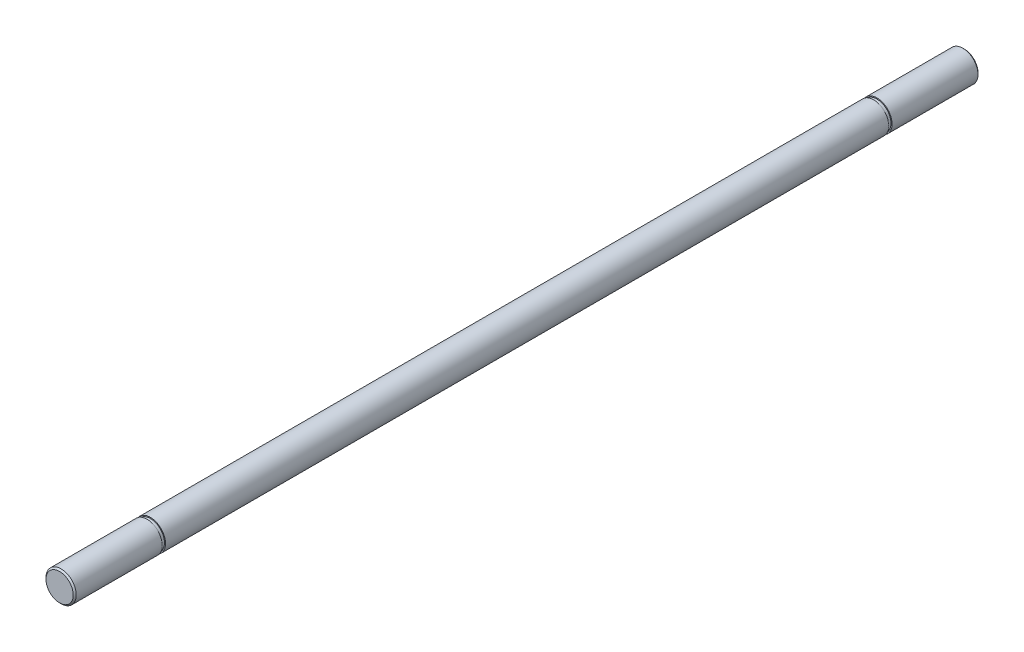
ISO-10303-21;
HEADER;
FILE_DESCRIPTION(('STEP AP214'),'2;1');
FILE_NAME('part.step','',(''),(''),'','','');
FILE_SCHEMA(('AUTOMOTIVE_DESIGN { 1 0 10303 214 1 1 1 1 }'));
ENDSEC;
DATA;
#1=APPLICATION_CONTEXT('core data for automotive mechanical design processes');
#2=APPLICATION_PROTOCOL_DEFINITION('international standard','automotive_design',2000,#1);
#3=PRODUCT_CONTEXT('',#1,'mechanical');
#4=PRODUCT('Part','Part','',(#3));
#5=PRODUCT_RELATED_PRODUCT_CATEGORY('part','',(#4));
#6=PRODUCT_DEFINITION_FORMATION('','',#4);
#7=PRODUCT_DEFINITION_CONTEXT('part definition',#1,'design');
#8=PRODUCT_DEFINITION('design','',#6,#7);
#9=PRODUCT_DEFINITION_SHAPE('','',#8);
#10=(LENGTH_UNIT() NAMED_UNIT(*) SI_UNIT(.MILLI.,.METRE.));
#11=(NAMED_UNIT(*) PLANE_ANGLE_UNIT() SI_UNIT($,.RADIAN.));
#12=(NAMED_UNIT(*) SI_UNIT($,.STERADIAN.) SOLID_ANGLE_UNIT());
#13=UNCERTAINTY_MEASURE_WITH_UNIT(LENGTH_MEASURE(1.E-05),#10,'distance_accuracy_value','');
#14=(GEOMETRIC_REPRESENTATION_CONTEXT(3) GLOBAL_UNCERTAINTY_ASSIGNED_CONTEXT((#13)) GLOBAL_UNIT_ASSIGNED_CONTEXT((#10,
#11,#12)) REPRESENTATION_CONTEXT('',''));
#15=CARTESIAN_POINT('',(0.,0.,0.));
#16=DIRECTION('',(0.,0.,1.));
#17=DIRECTION('',(1.,0.,0.));
#18=AXIS2_PLACEMENT_3D('',#15,#16,#17);
#19=CARTESIAN_POINT('',(0.,0.,149.5));
#20=DIRECTION('',(0.,0.,-1.));
#21=DIRECTION('',(-1.,0.,0.));
#22=AXIS2_PLACEMENT_3D('',#19,#20,#21);
#23=CYLINDRICAL_SURFACE('',#22,5.);
#24=CARTESIAN_POINT('',(0.,0.,119.5));
#25=DIRECTION('',(0.,0.,-1.));
#26=DIRECTION('',(-1.,0.,0.));
#27=AXIS2_PLACEMENT_3D('',#24,#25,#26);
#28=CIRCLE('',#27,5.);
#29=CARTESIAN_POINT('',(-5.,0.,119.5));
#30=VERTEX_POINT('',#29);
#31=EDGE_CURVE('E57',#30,#30,#28,.T.);
#32=ORIENTED_EDGE('',*,*,#31,.T.);
#33=EDGE_LOOP('',(#32));
#34=FACE_BOUND('',#33,.T.);
#35=CARTESIAN_POINT('',(0.,0.,-119.5));
#36=DIRECTION('',(0.,0.,1.));
#37=DIRECTION('',(1.,0.,0.));
#38=AXIS2_PLACEMENT_3D('',#35,#36,#37);
#39=CIRCLE('',#38,5.);
#40=CARTESIAN_POINT('',(5.,0.,-119.5));
#41=VERTEX_POINT('',#40);
#42=EDGE_CURVE('E52',#41,#41,#39,.T.);
#43=ORIENTED_EDGE('',*,*,#42,.T.);
#44=EDGE_LOOP('',(#43));
#45=FACE_BOUND('',#44,.T.);
#46=ADVANCED_FACE('F32',(#34,#45),#23,.T.);
#47=CARTESIAN_POINT('',(4.65,0.,-119.5));
#48=DIRECTION('',(0.,0.,1.));
#49=DIRECTION('',(1.,0.,0.));
#50=AXIS2_PLACEMENT_3D('',#47,#48,#49);
#51=PLANE('',#50);
#52=CARTESIAN_POINT('',(0.,0.,-119.5));
#53=DIRECTION('',(0.,0.,1.));
#54=DIRECTION('',(1.,0.,0.));
#55=AXIS2_PLACEMENT_3D('',#52,#53,#54);
#56=CIRCLE('',#55,4.65);
#57=CARTESIAN_POINT('',(4.65,0.,-119.5));
#58=VERTEX_POINT('',#57);
#59=EDGE_CURVE('E66',#58,#58,#56,.T.);
#60=ORIENTED_EDGE('',*,*,#59,.T.);
#61=EDGE_LOOP('',(#60));
#62=FACE_BOUND('',#61,.T.);
#63=ORIENTED_EDGE('',*,*,#42,.F.);
#64=EDGE_LOOP('',(#63));
#65=FACE_BOUND('',#64,.T.);
#66=ADVANCED_FACE('F88',(#62,#65),#51,.F.);
#67=CARTESIAN_POINT('',(4.65,0.,-120.6));
#68=DIRECTION('',(0.,0.,-1.));
#69=DIRECTION('',(-1.,0.,0.));
#70=AXIS2_PLACEMENT_3D('',#67,#68,#69);
#71=PLANE('',#70);
#72=CARTESIAN_POINT('',(0.,0.,-120.6));
#73=DIRECTION('',(0.,0.,1.));
#74=DIRECTION('',(1.,0.,0.));
#75=AXIS2_PLACEMENT_3D('',#72,#73,#74);
#76=CIRCLE('',#75,4.65);
#77=CARTESIAN_POINT('',(4.65,0.,-120.6));
#78=VERTEX_POINT('',#77);
#79=EDGE_CURVE('E56',#78,#78,#76,.T.);
#80=ORIENTED_EDGE('',*,*,#79,.F.);
#81=EDGE_LOOP('',(#80));
#82=FACE_BOUND('',#81,.T.);
#83=CARTESIAN_POINT('',(0.,0.,-120.6));
#84=DIRECTION('',(0.,0.,-1.));
#85=DIRECTION('',(-1.,0.,0.));
#86=AXIS2_PLACEMENT_3D('',#83,#84,#85);
#87=CIRCLE('',#86,5.);
#88=CARTESIAN_POINT('',(-5.,0.,-120.6));
#89=VERTEX_POINT('',#88);
#90=EDGE_CURVE('E63',#89,#89,#87,.T.);
#91=ORIENTED_EDGE('',*,*,#90,.F.);
#92=EDGE_LOOP('',(#91));
#93=FACE_BOUND('',#92,.T.);
#94=ADVANCED_FACE('F95',(#82,#93),#71,.F.);
#95=CARTESIAN_POINT('',(0.,0.,149.5));
#96=DIRECTION('',(0.,0.,1.));
#97=DIRECTION('',(1.,0.,0.));
#98=AXIS2_PLACEMENT_3D('',#95,#96,#97);
#99=CYLINDRICAL_SURFACE('',#98,4.65);
#100=ORIENTED_EDGE('',*,*,#59,.F.);
#101=EDGE_LOOP('',(#100));
#102=FACE_BOUND('',#101,.T.);
#103=ORIENTED_EDGE('',*,*,#79,.T.);
#104=EDGE_LOOP('',(#103));
#105=FACE_BOUND('',#104,.T.);
#106=ADVANCED_FACE('F101',(#102,#105),#99,.T.);
#107=CARTESIAN_POINT('',(0.,0.,-149.5));
#108=DIRECTION('',(0.,0.,1.));
#109=DIRECTION('',(1.,0.,0.));
#110=AXIS2_PLACEMENT_3D('',#107,#108,#109);
#111=PLANE('',#110);
#112=CARTESIAN_POINT('',(0.,0.,-149.5));
#113=DIRECTION('',(0.,0.,1.));
#114=DIRECTION('',(1.,0.,0.));
#115=AXIS2_PLACEMENT_3D('',#112,#113,#114);
#116=CIRCLE('',#115,4.50000000000003);
#117=CARTESIAN_POINT('',(4.50000000000003,0.,-149.5));
#118=VERTEX_POINT('',#117);
#119=EDGE_CURVE('E10',#118,#118,#116,.F.);
#120=ORIENTED_EDGE('',*,*,#119,.T.);
#121=EDGE_LOOP('',(#120));
#122=FACE_BOUND('',#121,.T.);
#123=ADVANCED_FACE('F108',(#122),#111,.F.);
#124=CARTESIAN_POINT('',(0.,0.,-149.));
#125=DIRECTION('',(0.,0.,1.));
#126=DIRECTION('',(1.,0.,0.));
#127=AXIS2_PLACEMENT_3D('',#124,#125,#126);
#128=CIRCLE('',#127,5.);
#129=CARTESIAN_POINT('',(5.,0.,-149.));
#130=VERTEX_POINT('',#129);
#131=EDGE_CURVE('E39',#130,#130,#128,.T.);
#132=ORIENTED_EDGE('',*,*,#131,.T.);
#133=EDGE_LOOP('',(#132));
#134=FACE_BOUND('',#133,.T.);
#135=ORIENTED_EDGE('',*,*,#90,.T.);
#136=EDGE_LOOP('',(#135));
#137=FACE_BOUND('',#136,.T.);
#138=ADVANCED_FACE('F90',(#134,#137),#23,.T.);
#139=CARTESIAN_POINT('',(4.65,0.,120.6));
#140=DIRECTION('',(0.,0.,1.));
#141=DIRECTION('',(1.,0.,0.));
#142=AXIS2_PLACEMENT_3D('',#139,#140,#141);
#143=PLANE('',#142);
#144=CARTESIAN_POINT('',(0.,0.,120.6));
#145=DIRECTION('',(0.,0.,1.));
#146=DIRECTION('',(1.,0.,0.));
#147=AXIS2_PLACEMENT_3D('',#144,#145,#146);
#148=CIRCLE('',#147,4.65);
#149=CARTESIAN_POINT('',(4.65,0.,120.6));
#150=VERTEX_POINT('',#149);
#151=EDGE_CURVE('E60',#150,#150,#148,.T.);
#152=ORIENTED_EDGE('',*,*,#151,.T.);
#153=EDGE_LOOP('',(#152));
#154=FACE_BOUND('',#153,.T.);
#155=CARTESIAN_POINT('',(0.,0.,120.6));
#156=DIRECTION('',(0.,0.,1.));
#157=DIRECTION('',(1.,0.,0.));
#158=AXIS2_PLACEMENT_3D('',#155,#156,#157);
#159=CIRCLE('',#158,5.);
#160=CARTESIAN_POINT('',(5.,0.,120.6));
#161=VERTEX_POINT('',#160);
#162=EDGE_CURVE('E53',#161,#161,#159,.T.);
#163=ORIENTED_EDGE('',*,*,#162,.F.);
#164=EDGE_LOOP('',(#163));
#165=FACE_BOUND('',#164,.T.);
#166=ADVANCED_FACE('F82',(#154,#165),#143,.F.);
#167=CARTESIAN_POINT('',(4.65,0.,119.5));
#168=DIRECTION('',(0.,0.,-1.));
#169=DIRECTION('',(-1.,0.,0.));
#170=AXIS2_PLACEMENT_3D('',#167,#168,#169);
#171=PLANE('',#170);
#172=CARTESIAN_POINT('',(0.,0.,119.5));
#173=DIRECTION('',(0.,0.,1.));
#174=DIRECTION('',(1.,0.,0.));
#175=AXIS2_PLACEMENT_3D('',#172,#173,#174);
#176=CIRCLE('',#175,4.65);
#177=CARTESIAN_POINT('',(4.65,0.,119.5));
#178=VERTEX_POINT('',#177);
#179=EDGE_CURVE('E73',#178,#178,#176,.T.);
#180=ORIENTED_EDGE('',*,*,#179,.F.);
#181=EDGE_LOOP('',(#180));
#182=FACE_BOUND('',#181,.T.);
#183=ORIENTED_EDGE('',*,*,#31,.F.);
#184=EDGE_LOOP('',(#183));
#185=FACE_BOUND('',#184,.T.);
#186=ADVANCED_FACE('F79',(#182,#185),#171,.F.);
#187=CARTESIAN_POINT('',(0.,0.,149.5));
#188=DIRECTION('',(0.,0.,1.));
#189=DIRECTION('',(1.,0.,0.));
#190=AXIS2_PLACEMENT_3D('',#187,#188,#189);
#191=CYLINDRICAL_SURFACE('',#190,4.65);
#192=ORIENTED_EDGE('',*,*,#151,.F.);
#193=EDGE_LOOP('',(#192));
#194=FACE_BOUND('',#193,.T.);
#195=ORIENTED_EDGE('',*,*,#179,.T.);
#196=EDGE_LOOP('',(#195));
#197=FACE_BOUND('',#196,.T.);
#198=ADVANCED_FACE('F77',(#194,#197),#191,.T.);
#199=CARTESIAN_POINT('',(0.,0.,149.5));
#200=DIRECTION('',(0.,0.,1.));
#201=DIRECTION('',(1.,0.,0.));
#202=AXIS2_PLACEMENT_3D('',#199,#200,#201);
#203=PLANE('',#202);
#204=CARTESIAN_POINT('',(0.,0.,149.5));
#205=DIRECTION('',(0.,0.,1.));
#206=DIRECTION('',(1.,0.,0.));
#207=AXIS2_PLACEMENT_3D('',#204,#205,#206);
#208=CIRCLE('',#207,4.5);
#209=CARTESIAN_POINT('',(4.5,0.,149.5));
#210=VERTEX_POINT('',#209);
#211=EDGE_CURVE('E47',#210,#210,#208,.T.);
#212=ORIENTED_EDGE('',*,*,#211,.T.);
#213=EDGE_LOOP('',(#212));
#214=FACE_BOUND('',#213,.T.);
#215=ADVANCED_FACE('F110',(#214),#203,.T.);
#216=CARTESIAN_POINT('',(0.,0.,149.));
#217=DIRECTION('',(0.,0.,1.));
#218=DIRECTION('',(1.,0.,0.));
#219=AXIS2_PLACEMENT_3D('',#216,#217,#218);
#220=CIRCLE('',#219,5.);
#221=CARTESIAN_POINT('',(5.,0.,149.));
#222=VERTEX_POINT('',#221);
#223=EDGE_CURVE('E43',#222,#222,#220,.F.);
#224=ORIENTED_EDGE('',*,*,#223,.T.);
#225=EDGE_LOOP('',(#224));
#226=FACE_BOUND('',#225,.T.);
#227=ORIENTED_EDGE('',*,*,#162,.T.);
#228=EDGE_LOOP('',(#227));
#229=FACE_BOUND('',#228,.T.);
#230=ADVANCED_FACE('F91',(#226,#229),#23,.T.);
#231=CARTESIAN_POINT('',(0.,0.,149.5));
#232=DIRECTION('',(0.,0.,-1.));
#233=DIRECTION('',(-1.,0.,0.));
#234=AXIS2_PLACEMENT_3D('',#231,#232,#233);
#235=CONICAL_SURFACE('',#234,4.5,0.785398163397445);
#236=ORIENTED_EDGE('',*,*,#223,.F.);
#237=EDGE_LOOP('',(#236));
#238=FACE_BOUND('',#237,.T.);
#239=ORIENTED_EDGE('',*,*,#211,.F.);
#240=EDGE_LOOP('',(#239));
#241=FACE_BOUND('',#240,.T.);
#242=ADVANCED_FACE('F116',(#238,#241),#235,.T.);
#243=CARTESIAN_POINT('',(0.,0.,-149.));
#244=DIRECTION('',(0.,0.,1.));
#245=DIRECTION('',(1.,0.,0.));
#246=AXIS2_PLACEMENT_3D('',#243,#244,#245);
#247=CONICAL_SURFACE('',#246,5.,0.785398163397417);
#248=ORIENTED_EDGE('',*,*,#119,.F.);
#249=EDGE_LOOP('',(#248));
#250=FACE_BOUND('',#249,.T.);
#251=ORIENTED_EDGE('',*,*,#131,.F.);
#252=EDGE_LOOP('',(#251));
#253=FACE_BOUND('',#252,.T.);
#254=ADVANCED_FACE('F34',(#250,#253),#247,.T.);
#255=CLOSED_SHELL('',(#46,#66,#94,#106,#123,#138,#166,#186,#198,#215,#230,#242,#254));
#256=MANIFOLD_SOLID_BREP('B2',#255);
#257=ADVANCED_BREP_SHAPE_REPRESENTATION('',(#18,#256),#14);
#258=SHAPE_DEFINITION_REPRESENTATION(#9,#257);
ENDSEC;
END-ISO-10303-21;
